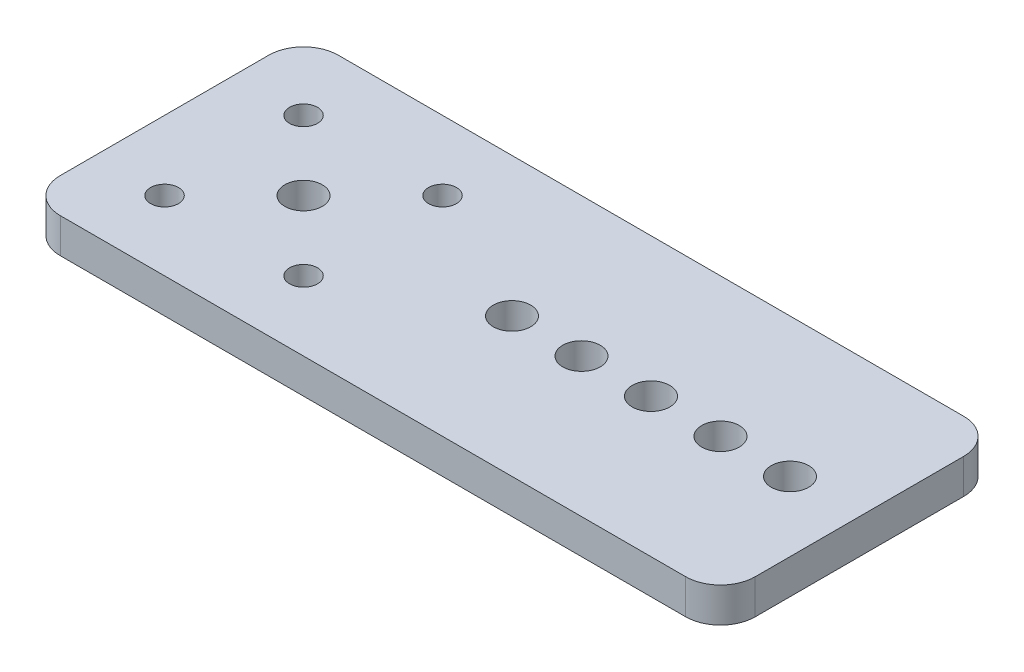
ISO-10303-21;
HEADER;
FILE_DESCRIPTION(('STEP AP214'),'2;1');
FILE_NAME('part.step','',(''),(''),'','','');
FILE_SCHEMA(('AUTOMOTIVE_DESIGN { 1 0 10303 214 1 1 1 1 }'));
ENDSEC;
DATA;
#1=APPLICATION_CONTEXT('core data for automotive mechanical design processes');
#2=APPLICATION_PROTOCOL_DEFINITION('international standard','automotive_design',2000,#1);
#3=PRODUCT_CONTEXT('',#1,'mechanical');
#4=PRODUCT('Part','Part','',(#3));
#5=PRODUCT_RELATED_PRODUCT_CATEGORY('part','',(#4));
#6=PRODUCT_DEFINITION_FORMATION('','',#4);
#7=PRODUCT_DEFINITION_CONTEXT('part definition',#1,'design');
#8=PRODUCT_DEFINITION('design','',#6,#7);
#9=PRODUCT_DEFINITION_SHAPE('','',#8);
#10=(LENGTH_UNIT() NAMED_UNIT(*) SI_UNIT(.MILLI.,.METRE.));
#11=(NAMED_UNIT(*) PLANE_ANGLE_UNIT() SI_UNIT($,.RADIAN.));
#12=(NAMED_UNIT(*) SI_UNIT($,.STERADIAN.) SOLID_ANGLE_UNIT());
#13=UNCERTAINTY_MEASURE_WITH_UNIT(LENGTH_MEASURE(1.E-05),#10,'distance_accuracy_value','');
#14=(GEOMETRIC_REPRESENTATION_CONTEXT(3) GLOBAL_UNCERTAINTY_ASSIGNED_CONTEXT((#13)) GLOBAL_UNIT_ASSIGNED_CONTEXT((#10,
#11,#12)) REPRESENTATION_CONTEXT('',''));
#15=CARTESIAN_POINT('',(0.,0.,0.));
#16=DIRECTION('',(0.,0.,1.));
#17=DIRECTION('',(1.,0.,0.));
#18=AXIS2_PLACEMENT_3D('',#15,#16,#17);
#19=CARTESIAN_POINT('',(0.,6.35,0.));
#20=DIRECTION('',(0.,1.,0.));
#21=DIRECTION('',(0.,0.,1.));
#22=AXIS2_PLACEMENT_3D('',#19,#20,#21);
#23=PLANE('',#22);
#24=CARTESIAN_POINT('',(88.9,6.35,25.4));
#25=DIRECTION('',(0.,1.,0.));
#26=DIRECTION('',(0.,0.,1.));
#27=AXIS2_PLACEMENT_3D('',#24,#25,#26);
#28=CIRCLE('',#27,3.429);
#29=CARTESIAN_POINT('',(88.9,6.35,28.829));
#30=VERTEX_POINT('',#29);
#31=EDGE_CURVE('E241',#30,#30,#28,.T.);
#32=ORIENTED_EDGE('',*,*,#31,.F.);
#33=EDGE_LOOP('',(#32));
#34=FACE_BOUND('',#33,.T.);
#35=CARTESIAN_POINT('',(63.5,6.35,25.4));
#36=DIRECTION('',(0.,1.,0.));
#37=DIRECTION('',(0.,0.,1.));
#38=AXIS2_PLACEMENT_3D('',#35,#36,#37);
#39=CIRCLE('',#38,3.429);
#40=CARTESIAN_POINT('',(63.5,6.35,28.829));
#41=VERTEX_POINT('',#40);
#42=EDGE_CURVE('E256',#41,#41,#39,.T.);
#43=ORIENTED_EDGE('',*,*,#42,.F.);
#44=EDGE_LOOP('',(#43));
#45=FACE_BOUND('',#44,.T.);
#46=CARTESIAN_POINT('',(38.1000000000003,6.35,38.1));
#47=DIRECTION('',(0.,1.,0.));
#48=DIRECTION('',(0.,0.,1.));
#49=AXIS2_PLACEMENT_3D('',#46,#47,#48);
#50=CIRCLE('',#49,2.5527);
#51=CARTESIAN_POINT('',(38.1000000000003,6.35,40.6527));
#52=VERTEX_POINT('',#51);
#53=EDGE_CURVE('E273',#52,#52,#50,.T.);
#54=ORIENTED_EDGE('',*,*,#53,.F.);
#55=EDGE_LOOP('',(#54));
#56=FACE_BOUND('',#55,.T.);
#57=CARTESIAN_POINT('',(101.6,6.35,25.4));
#58=DIRECTION('',(0.,1.,0.));
#59=DIRECTION('',(0.,0.,1.));
#60=AXIS2_PLACEMENT_3D('',#57,#58,#59);
#61=CIRCLE('',#60,3.429);
#62=CARTESIAN_POINT('',(101.6,6.35,28.829));
#63=VERTEX_POINT('',#62);
#64=EDGE_CURVE('E274',#63,#63,#61,.T.);
#65=ORIENTED_EDGE('',*,*,#64,.F.);
#66=EDGE_LOOP('',(#65));
#67=FACE_BOUND('',#66,.T.);
#68=CARTESIAN_POINT('',(12.7,6.35,12.7));
#69=DIRECTION('',(0.,1.,0.));
#70=DIRECTION('',(0.,0.,1.));
#71=AXIS2_PLACEMENT_3D('',#68,#69,#70);
#72=CIRCLE('',#71,2.5527);
#73=CARTESIAN_POINT('',(12.7,6.35,15.2527));
#74=VERTEX_POINT('',#73);
#75=EDGE_CURVE('E131',#74,#74,#72,.T.);
#76=ORIENTED_EDGE('',*,*,#75,.F.);
#77=EDGE_LOOP('',(#76));
#78=FACE_BOUND('',#77,.T.);
#79=DIRECTION('',(-1.,0.,0.));
#80=VECTOR('',#79,1.);
#81=CARTESIAN_POINT('',(0.,6.35,0.));
#82=LINE('',#81,#80);
#83=CARTESIAN_POINT('',(120.65,6.35,0.));
#84=VERTEX_POINT('',#83);
#85=CARTESIAN_POINT('',(6.35,6.35,0.));
#86=VERTEX_POINT('',#85);
#87=EDGE_CURVE('E141',#84,#86,#82,.T.);
#88=ORIENTED_EDGE('',*,*,#87,.T.);
#89=CARTESIAN_POINT('',(6.35,6.35,6.35));
#90=DIRECTION('',(0.,1.,0.));
#91=DIRECTION('',(0.,0.,1.));
#92=AXIS2_PLACEMENT_3D('',#89,#90,#91);
#93=CIRCLE('',#92,6.35);
#94=CARTESIAN_POINT('',(0.,6.35,6.35));
#95=VERTEX_POINT('',#94);
#96=EDGE_CURVE('E186',#86,#95,#93,.T.);
#97=ORIENTED_EDGE('',*,*,#96,.T.);
#98=DIRECTION('',(0.,0.,1.));
#99=VECTOR('',#98,1.);
#100=CARTESIAN_POINT('',(0.,6.35,0.));
#101=LINE('',#100,#99);
#102=CARTESIAN_POINT('',(0.,6.35,44.45));
#103=VERTEX_POINT('',#102);
#104=EDGE_CURVE('E123',#95,#103,#101,.T.);
#105=ORIENTED_EDGE('',*,*,#104,.T.);
#106=CARTESIAN_POINT('',(6.35,6.35,44.45));
#107=DIRECTION('',(0.,1.,0.));
#108=DIRECTION('',(0.,0.,1.));
#109=AXIS2_PLACEMENT_3D('',#106,#107,#108);
#110=CIRCLE('',#109,6.35);
#111=CARTESIAN_POINT('',(6.35,6.35,50.8));
#112=VERTEX_POINT('',#111);
#113=EDGE_CURVE('E183',#103,#112,#110,.T.);
#114=ORIENTED_EDGE('',*,*,#113,.T.);
#115=DIRECTION('',(1.,0.,0.));
#116=VECTOR('',#115,1.);
#117=CARTESIAN_POINT('',(0.,6.35,50.8));
#118=LINE('',#117,#116);
#119=CARTESIAN_POINT('',(120.65,6.35,50.8));
#120=VERTEX_POINT('',#119);
#121=EDGE_CURVE('E172',#112,#120,#118,.T.);
#122=ORIENTED_EDGE('',*,*,#121,.T.);
#123=CARTESIAN_POINT('',(120.65,6.35,44.45));
#124=DIRECTION('',(0.,1.,0.));
#125=DIRECTION('',(0.,0.,1.));
#126=AXIS2_PLACEMENT_3D('',#123,#124,#125);
#127=CIRCLE('',#126,6.35);
#128=CARTESIAN_POINT('',(127.,6.35,44.45));
#129=VERTEX_POINT('',#128);
#130=EDGE_CURVE('E58',#120,#129,#127,.T.);
#131=ORIENTED_EDGE('',*,*,#130,.T.);
#132=DIRECTION('',(0.,0.,-1.));
#133=VECTOR('',#132,1.);
#134=CARTESIAN_POINT('',(127.,6.35,0.));
#135=LINE('',#134,#133);
#136=CARTESIAN_POINT('',(127.,6.35,6.35));
#137=VERTEX_POINT('',#136);
#138=EDGE_CURVE('E169',#129,#137,#135,.T.);
#139=ORIENTED_EDGE('',*,*,#138,.T.);
#140=CARTESIAN_POINT('',(120.65,6.35,6.35));
#141=DIRECTION('',(0.,1.,0.));
#142=DIRECTION('',(0.,0.,1.));
#143=AXIS2_PLACEMENT_3D('',#140,#141,#142);
#144=CIRCLE('',#143,6.35);
#145=EDGE_CURVE('E159',#137,#84,#144,.T.);
#146=ORIENTED_EDGE('',*,*,#145,.T.);
#147=EDGE_LOOP('',(#88,#97,#105,#114,#122,#131,#139,#146));
#148=FACE_BOUND('',#147,.T.);
#149=CARTESIAN_POINT('',(25.4,6.35,25.4));
#150=DIRECTION('',(0.,1.,0.));
#151=DIRECTION('',(0.,0.,1.));
#152=AXIS2_PLACEMENT_3D('',#149,#150,#151);
#153=CIRCLE('',#152,3.429);
#154=CARTESIAN_POINT('',(25.4,6.35,28.829));
#155=VERTEX_POINT('',#154);
#156=EDGE_CURVE('E211',#155,#155,#153,.T.);
#157=ORIENTED_EDGE('',*,*,#156,.F.);
#158=EDGE_LOOP('',(#157));
#159=FACE_BOUND('',#158,.T.);
#160=CARTESIAN_POINT('',(38.1,6.35,12.7));
#161=DIRECTION('',(0.,1.,0.));
#162=DIRECTION('',(0.,0.,1.));
#163=AXIS2_PLACEMENT_3D('',#160,#161,#162);
#164=CIRCLE('',#163,2.5527);
#165=CARTESIAN_POINT('',(38.1,6.35,15.2527));
#166=VERTEX_POINT('',#165);
#167=EDGE_CURVE('E216',#166,#166,#164,.T.);
#168=ORIENTED_EDGE('',*,*,#167,.F.);
#169=EDGE_LOOP('',(#168));
#170=FACE_BOUND('',#169,.T.);
#171=CARTESIAN_POINT('',(12.7000000000003,6.35,38.1));
#172=DIRECTION('',(0.,1.,0.));
#173=DIRECTION('',(0.,0.,1.));
#174=AXIS2_PLACEMENT_3D('',#171,#172,#173);
#175=CIRCLE('',#174,2.5527);
#176=CARTESIAN_POINT('',(12.7000000000003,6.35,40.6527));
#177=VERTEX_POINT('',#176);
#178=EDGE_CURVE('E222',#177,#177,#175,.T.);
#179=ORIENTED_EDGE('',*,*,#178,.F.);
#180=EDGE_LOOP('',(#179));
#181=FACE_BOUND('',#180,.T.);
#182=CARTESIAN_POINT('',(76.2,6.35,25.4));
#183=DIRECTION('',(0.,1.,0.));
#184=DIRECTION('',(0.,0.,1.));
#185=AXIS2_PLACEMENT_3D('',#182,#183,#184);
#186=CIRCLE('',#185,3.429);
#187=CARTESIAN_POINT('',(76.2,6.35,28.829));
#188=VERTEX_POINT('',#187);
#189=EDGE_CURVE('E228',#188,#188,#186,.T.);
#190=ORIENTED_EDGE('',*,*,#189,.F.);
#191=EDGE_LOOP('',(#190));
#192=FACE_BOUND('',#191,.T.);
#193=CARTESIAN_POINT('',(114.3,6.35,25.4));
#194=DIRECTION('',(0.,1.,0.));
#195=DIRECTION('',(0.,0.,1.));
#196=AXIS2_PLACEMENT_3D('',#193,#194,#195);
#197=CIRCLE('',#196,3.429);
#198=CARTESIAN_POINT('',(114.3,6.35,28.829));
#199=VERTEX_POINT('',#198);
#200=EDGE_CURVE('E234',#199,#199,#197,.T.);
#201=ORIENTED_EDGE('',*,*,#200,.F.);
#202=EDGE_LOOP('',(#201));
#203=FACE_BOUND('',#202,.T.);
#204=ADVANCED_FACE('F38',(#34,#45,#56,#67,#78,#148,#159,#170,#181,#192,#203),#23,.T.);
#205=CARTESIAN_POINT('',(0.,0.,0.));
#206=DIRECTION('',(0.,1.,0.));
#207=DIRECTION('',(0.,0.,1.));
#208=AXIS2_PLACEMENT_3D('',#205,#206,#207);
#209=PLANE('',#208);
#210=DIRECTION('',(0.,0.,1.));
#211=VECTOR('',#210,1.);
#212=CARTESIAN_POINT('',(0.,0.,0.));
#213=LINE('',#212,#211);
#214=CARTESIAN_POINT('',(0.,0.,6.35));
#215=VERTEX_POINT('',#214);
#216=CARTESIAN_POINT('',(0.,0.,44.45));
#217=VERTEX_POINT('',#216);
#218=EDGE_CURVE('E120',#215,#217,#213,.T.);
#219=ORIENTED_EDGE('',*,*,#218,.F.);
#220=CARTESIAN_POINT('',(6.35,0.,6.35));
#221=DIRECTION('',(0.,1.,0.));
#222=DIRECTION('',(0.,0.,1.));
#223=AXIS2_PLACEMENT_3D('',#220,#221,#222);
#224=CIRCLE('',#223,6.35);
#225=CARTESIAN_POINT('',(6.35,0.,0.));
#226=VERTEX_POINT('',#225);
#227=EDGE_CURVE('E103',#215,#226,#224,.F.);
#228=ORIENTED_EDGE('',*,*,#227,.T.);
#229=DIRECTION('',(-1.,0.,0.));
#230=VECTOR('',#229,1.);
#231=CARTESIAN_POINT('',(0.,0.,0.));
#232=LINE('',#231,#230);
#233=CARTESIAN_POINT('',(120.65,0.,0.));
#234=VERTEX_POINT('',#233);
#235=EDGE_CURVE('E146',#234,#226,#232,.T.);
#236=ORIENTED_EDGE('',*,*,#235,.F.);
#237=CARTESIAN_POINT('',(120.65,0.,6.35));
#238=DIRECTION('',(0.,1.,0.));
#239=DIRECTION('',(0.,0.,1.));
#240=AXIS2_PLACEMENT_3D('',#237,#238,#239);
#241=CIRCLE('',#240,6.35);
#242=CARTESIAN_POINT('',(127.,0.,6.35));
#243=VERTEX_POINT('',#242);
#244=EDGE_CURVE('E150',#234,#243,#241,.F.);
#245=ORIENTED_EDGE('',*,*,#244,.T.);
#246=DIRECTION('',(0.,0.,-1.));
#247=VECTOR('',#246,1.);
#248=CARTESIAN_POINT('',(127.,0.,0.));
#249=LINE('',#248,#247);
#250=CARTESIAN_POINT('',(127.,0.,44.45));
#251=VERTEX_POINT('',#250);
#252=EDGE_CURVE('E134',#251,#243,#249,.T.);
#253=ORIENTED_EDGE('',*,*,#252,.F.);
#254=CARTESIAN_POINT('',(120.65,0.,44.45));
#255=DIRECTION('',(0.,1.,0.));
#256=DIRECTION('',(0.,0.,1.));
#257=AXIS2_PLACEMENT_3D('',#254,#255,#256);
#258=CIRCLE('',#257,6.35);
#259=CARTESIAN_POINT('',(120.65,0.,50.8));
#260=VERTEX_POINT('',#259);
#261=EDGE_CURVE('E124',#251,#260,#258,.F.);
#262=ORIENTED_EDGE('',*,*,#261,.T.);
#263=DIRECTION('',(1.,0.,0.));
#264=VECTOR('',#263,1.);
#265=CARTESIAN_POINT('',(0.,0.,50.8));
#266=LINE('',#265,#264);
#267=CARTESIAN_POINT('',(6.35,0.,50.8));
#268=VERTEX_POINT('',#267);
#269=EDGE_CURVE('E130',#268,#260,#266,.T.);
#270=ORIENTED_EDGE('',*,*,#269,.F.);
#271=CARTESIAN_POINT('',(6.35,0.,44.45));
#272=DIRECTION('',(0.,1.,0.));
#273=DIRECTION('',(0.,0.,1.));
#274=AXIS2_PLACEMENT_3D('',#271,#272,#273);
#275=CIRCLE('',#274,6.35);
#276=EDGE_CURVE('E114',#268,#217,#275,.F.);
#277=ORIENTED_EDGE('',*,*,#276,.T.);
#278=EDGE_LOOP('',(#219,#228,#236,#245,#253,#262,#270,#277));
#279=FACE_BOUND('',#278,.T.);
#280=CARTESIAN_POINT('',(12.7,0.,12.7));
#281=DIRECTION('',(0.,1.,0.));
#282=DIRECTION('',(0.,0.,1.));
#283=AXIS2_PLACEMENT_3D('',#280,#281,#282);
#284=CIRCLE('',#283,2.5527);
#285=CARTESIAN_POINT('',(12.7,0.,15.2527));
#286=VERTEX_POINT('',#285);
#287=EDGE_CURVE('E138',#286,#286,#284,.T.);
#288=ORIENTED_EDGE('',*,*,#287,.T.);
#289=EDGE_LOOP('',(#288));
#290=FACE_BOUND('',#289,.T.);
#291=CARTESIAN_POINT('',(25.4,0.,25.4));
#292=DIRECTION('',(0.,1.,0.));
#293=DIRECTION('',(0.,0.,1.));
#294=AXIS2_PLACEMENT_3D('',#291,#292,#293);
#295=CIRCLE('',#294,3.429);
#296=CARTESIAN_POINT('',(25.4,0.,28.829));
#297=VERTEX_POINT('',#296);
#298=EDGE_CURVE('E214',#297,#297,#295,.T.);
#299=ORIENTED_EDGE('',*,*,#298,.T.);
#300=EDGE_LOOP('',(#299));
#301=FACE_BOUND('',#300,.T.);
#302=CARTESIAN_POINT('',(101.6,0.,25.4));
#303=DIRECTION('',(0.,1.,0.));
#304=DIRECTION('',(0.,0.,1.));
#305=AXIS2_PLACEMENT_3D('',#302,#303,#304);
#306=CIRCLE('',#305,3.429);
#307=CARTESIAN_POINT('',(101.6,0.,28.829));
#308=VERTEX_POINT('',#307);
#309=EDGE_CURVE('E219',#308,#308,#306,.T.);
#310=ORIENTED_EDGE('',*,*,#309,.T.);
#311=EDGE_LOOP('',(#310));
#312=FACE_BOUND('',#311,.T.);
#313=CARTESIAN_POINT('',(38.1,0.,12.7));
#314=DIRECTION('',(0.,1.,0.));
#315=DIRECTION('',(0.,0.,1.));
#316=AXIS2_PLACEMENT_3D('',#313,#314,#315);
#317=CIRCLE('',#316,2.5527);
#318=CARTESIAN_POINT('',(38.1,0.,15.2527));
#319=VERTEX_POINT('',#318);
#320=EDGE_CURVE('E220',#319,#319,#317,.T.);
#321=ORIENTED_EDGE('',*,*,#320,.T.);
#322=EDGE_LOOP('',(#321));
#323=FACE_BOUND('',#322,.T.);
#324=CARTESIAN_POINT('',(38.1000000000003,0.,38.1));
#325=DIRECTION('',(0.,1.,0.));
#326=DIRECTION('',(0.,0.,1.));
#327=AXIS2_PLACEMENT_3D('',#324,#325,#326);
#328=CIRCLE('',#327,2.5527);
#329=CARTESIAN_POINT('',(38.1000000000003,0.,40.6527));
#330=VERTEX_POINT('',#329);
#331=EDGE_CURVE('E225',#330,#330,#328,.T.);
#332=ORIENTED_EDGE('',*,*,#331,.T.);
#333=EDGE_LOOP('',(#332));
#334=FACE_BOUND('',#333,.T.);
#335=CARTESIAN_POINT('',(12.7000000000003,0.,38.1));
#336=DIRECTION('',(0.,1.,0.));
#337=DIRECTION('',(0.,0.,1.));
#338=AXIS2_PLACEMENT_3D('',#335,#336,#337);
#339=CIRCLE('',#338,2.5527);
#340=CARTESIAN_POINT('',(12.7000000000003,0.,40.6527));
#341=VERTEX_POINT('',#340);
#342=EDGE_CURVE('E226',#341,#341,#339,.T.);
#343=ORIENTED_EDGE('',*,*,#342,.T.);
#344=EDGE_LOOP('',(#343));
#345=FACE_BOUND('',#344,.T.);
#346=CARTESIAN_POINT('',(63.5,0.,25.4));
#347=DIRECTION('',(0.,1.,0.));
#348=DIRECTION('',(0.,0.,1.));
#349=AXIS2_PLACEMENT_3D('',#346,#347,#348);
#350=CIRCLE('',#349,3.429);
#351=CARTESIAN_POINT('',(63.5,0.,28.829));
#352=VERTEX_POINT('',#351);
#353=EDGE_CURVE('E231',#352,#352,#350,.T.);
#354=ORIENTED_EDGE('',*,*,#353,.T.);
#355=EDGE_LOOP('',(#354));
#356=FACE_BOUND('',#355,.T.);
#357=CARTESIAN_POINT('',(76.2,0.,25.4));
#358=DIRECTION('',(0.,1.,0.));
#359=DIRECTION('',(0.,0.,1.));
#360=AXIS2_PLACEMENT_3D('',#357,#358,#359);
#361=CIRCLE('',#360,3.429);
#362=CARTESIAN_POINT('',(76.2,0.,28.829));
#363=VERTEX_POINT('',#362);
#364=EDGE_CURVE('E232',#363,#363,#361,.T.);
#365=ORIENTED_EDGE('',*,*,#364,.T.);
#366=EDGE_LOOP('',(#365));
#367=FACE_BOUND('',#366,.T.);
#368=CARTESIAN_POINT('',(88.9,0.,25.4));
#369=DIRECTION('',(0.,1.,0.));
#370=DIRECTION('',(0.,0.,1.));
#371=AXIS2_PLACEMENT_3D('',#368,#369,#370);
#372=CIRCLE('',#371,3.429);
#373=CARTESIAN_POINT('',(88.9,0.,28.829));
#374=VERTEX_POINT('',#373);
#375=EDGE_CURVE('E236',#374,#374,#372,.T.);
#376=ORIENTED_EDGE('',*,*,#375,.T.);
#377=EDGE_LOOP('',(#376));
#378=FACE_BOUND('',#377,.T.);
#379=CARTESIAN_POINT('',(114.3,0.,25.4));
#380=DIRECTION('',(0.,1.,0.));
#381=DIRECTION('',(0.,0.,1.));
#382=AXIS2_PLACEMENT_3D('',#379,#380,#381);
#383=CIRCLE('',#382,3.429);
#384=CARTESIAN_POINT('',(114.3,0.,28.829));
#385=VERTEX_POINT('',#384);
#386=EDGE_CURVE('E237',#385,#385,#383,.T.);
#387=ORIENTED_EDGE('',*,*,#386,.T.);
#388=EDGE_LOOP('',(#387));
#389=FACE_BOUND('',#388,.T.);
#390=ADVANCED_FACE('F127',(#279,#290,#301,#312,#323,#334,#345,#356,#367,#378,#389),#209,.F.);
#391=CARTESIAN_POINT('',(0.,6.35,0.));
#392=DIRECTION('',(1.,0.,0.));
#393=DIRECTION('',(0.,0.,-1.));
#394=AXIS2_PLACEMENT_3D('',#391,#392,#393);
#395=PLANE('',#394);
#396=ORIENTED_EDGE('',*,*,#104,.F.);
#397=DIRECTION('',(0.,-1.,0.));
#398=VECTOR('',#397,1.);
#399=CARTESIAN_POINT('',(0.,6.35,6.35));
#400=LINE('',#399,#398);
#401=EDGE_CURVE('E107',#95,#215,#400,.T.);
#402=ORIENTED_EDGE('',*,*,#401,.T.);
#403=ORIENTED_EDGE('',*,*,#218,.T.);
#404=DIRECTION('',(0.,-1.,0.));
#405=VECTOR('',#404,1.);
#406=CARTESIAN_POINT('',(0.,6.35,44.45));
#407=LINE('',#406,#405);
#408=EDGE_CURVE('E125',#217,#103,#407,.F.);
#409=ORIENTED_EDGE('',*,*,#408,.T.);
#410=EDGE_LOOP('',(#396,#402,#403,#409));
#411=FACE_BOUND('',#410,.T.);
#412=ADVANCED_FACE('F119',(#411),#395,.F.);
#413=CARTESIAN_POINT('',(0.,6.35,50.8));
#414=DIRECTION('',(0.,0.,-1.));
#415=DIRECTION('',(-1.,0.,0.));
#416=AXIS2_PLACEMENT_3D('',#413,#414,#415);
#417=PLANE('',#416);
#418=ORIENTED_EDGE('',*,*,#121,.F.);
#419=DIRECTION('',(0.,-1.,0.));
#420=VECTOR('',#419,1.);
#421=CARTESIAN_POINT('',(6.35,6.35,50.8));
#422=LINE('',#421,#420);
#423=EDGE_CURVE('E192',#112,#268,#422,.T.);
#424=ORIENTED_EDGE('',*,*,#423,.T.);
#425=ORIENTED_EDGE('',*,*,#269,.T.);
#426=DIRECTION('',(0.,-1.,0.));
#427=VECTOR('',#426,1.);
#428=CARTESIAN_POINT('',(120.65,6.35,50.8));
#429=LINE('',#428,#427);
#430=EDGE_CURVE('E190',#260,#120,#429,.F.);
#431=ORIENTED_EDGE('',*,*,#430,.T.);
#432=EDGE_LOOP('',(#418,#424,#425,#431));
#433=FACE_BOUND('',#432,.T.);
#434=ADVANCED_FACE('F316',(#433),#417,.F.);
#435=CARTESIAN_POINT('',(127.,6.35,0.));
#436=DIRECTION('',(-1.,0.,0.));
#437=DIRECTION('',(0.,0.,1.));
#438=AXIS2_PLACEMENT_3D('',#435,#436,#437);
#439=PLANE('',#438);
#440=ORIENTED_EDGE('',*,*,#252,.T.);
#441=DIRECTION('',(0.,-1.,0.));
#442=VECTOR('',#441,1.);
#443=CARTESIAN_POINT('',(127.,6.35,6.35));
#444=LINE('',#443,#442);
#445=EDGE_CURVE('E12',#243,#137,#444,.F.);
#446=ORIENTED_EDGE('',*,*,#445,.T.);
#447=ORIENTED_EDGE('',*,*,#138,.F.);
#448=DIRECTION('',(0.,-1.,0.));
#449=VECTOR('',#448,1.);
#450=CARTESIAN_POINT('',(127.,6.35,44.45));
#451=LINE('',#450,#449);
#452=EDGE_CURVE('E46',#129,#251,#451,.T.);
#453=ORIENTED_EDGE('',*,*,#452,.T.);
#454=EDGE_LOOP('',(#440,#446,#447,#453));
#455=FACE_BOUND('',#454,.T.);
#456=ADVANCED_FACE('F197',(#455),#439,.F.);
#457=CARTESIAN_POINT('',(0.,6.35,0.));
#458=DIRECTION('',(0.,0.,1.));
#459=DIRECTION('',(1.,0.,0.));
#460=AXIS2_PLACEMENT_3D('',#457,#458,#459);
#461=PLANE('',#460);
#462=ORIENTED_EDGE('',*,*,#235,.T.);
#463=DIRECTION('',(0.,-1.,0.));
#464=VECTOR('',#463,1.);
#465=CARTESIAN_POINT('',(6.35,6.35,0.));
#466=LINE('',#465,#464);
#467=EDGE_CURVE('E108',#226,#86,#466,.F.);
#468=ORIENTED_EDGE('',*,*,#467,.T.);
#469=ORIENTED_EDGE('',*,*,#87,.F.);
#470=DIRECTION('',(0.,-1.,0.));
#471=VECTOR('',#470,1.);
#472=CARTESIAN_POINT('',(120.65,6.35,0.));
#473=LINE('',#472,#471);
#474=EDGE_CURVE('E113',#84,#234,#473,.T.);
#475=ORIENTED_EDGE('',*,*,#474,.T.);
#476=EDGE_LOOP('',(#462,#468,#469,#475));
#477=FACE_BOUND('',#476,.T.);
#478=ADVANCED_FACE('F205',(#477),#461,.F.);
#479=CARTESIAN_POINT('',(12.7,6.35,12.7));
#480=DIRECTION('',(0.,-1.,0.));
#481=DIRECTION('',(0.,0.,-1.));
#482=AXIS2_PLACEMENT_3D('',#479,#480,#481);
#483=CYLINDRICAL_SURFACE('',#482,2.5527);
#484=ORIENTED_EDGE('',*,*,#75,.T.);
#485=EDGE_LOOP('',(#484));
#486=FACE_BOUND('',#485,.T.);
#487=ORIENTED_EDGE('',*,*,#287,.F.);
#488=EDGE_LOOP('',(#487));
#489=FACE_BOUND('',#488,.T.);
#490=ADVANCED_FACE('F290',(#486,#489),#483,.F.);
#491=CARTESIAN_POINT('',(25.4,6.35,25.4));
#492=DIRECTION('',(0.,-1.,0.));
#493=DIRECTION('',(0.,0.,-1.));
#494=AXIS2_PLACEMENT_3D('',#491,#492,#493);
#495=CYLINDRICAL_SURFACE('',#494,3.429);
#496=ORIENTED_EDGE('',*,*,#156,.T.);
#497=EDGE_LOOP('',(#496));
#498=FACE_BOUND('',#497,.T.);
#499=ORIENTED_EDGE('',*,*,#298,.F.);
#500=EDGE_LOOP('',(#499));
#501=FACE_BOUND('',#500,.T.);
#502=ADVANCED_FACE('F287',(#498,#501),#495,.F.);
#503=CARTESIAN_POINT('',(101.6,6.35,25.4));
#504=DIRECTION('',(0.,-1.,0.));
#505=DIRECTION('',(0.,0.,-1.));
#506=AXIS2_PLACEMENT_3D('',#503,#504,#505);
#507=CYLINDRICAL_SURFACE('',#506,3.429);
#508=ORIENTED_EDGE('',*,*,#64,.T.);
#509=EDGE_LOOP('',(#508));
#510=FACE_BOUND('',#509,.T.);
#511=ORIENTED_EDGE('',*,*,#309,.F.);
#512=EDGE_LOOP('',(#511));
#513=FACE_BOUND('',#512,.T.);
#514=ADVANCED_FACE('F289',(#510,#513),#507,.F.);
#515=CARTESIAN_POINT('',(38.1,6.35,12.7));
#516=DIRECTION('',(0.,-1.,0.));
#517=DIRECTION('',(0.,0.,-1.));
#518=AXIS2_PLACEMENT_3D('',#515,#516,#517);
#519=CYLINDRICAL_SURFACE('',#518,2.5527);
#520=ORIENTED_EDGE('',*,*,#167,.T.);
#521=EDGE_LOOP('',(#520));
#522=FACE_BOUND('',#521,.T.);
#523=ORIENTED_EDGE('',*,*,#320,.F.);
#524=EDGE_LOOP('',(#523));
#525=FACE_BOUND('',#524,.T.);
#526=ADVANCED_FACE('F297',(#522,#525),#519,.F.);
#527=CARTESIAN_POINT('',(38.1000000000003,6.35,38.1));
#528=DIRECTION('',(0.,-1.,0.));
#529=DIRECTION('',(0.,0.,-1.));
#530=AXIS2_PLACEMENT_3D('',#527,#528,#529);
#531=CYLINDRICAL_SURFACE('',#530,2.5527);
#532=ORIENTED_EDGE('',*,*,#53,.T.);
#533=EDGE_LOOP('',(#532));
#534=FACE_BOUND('',#533,.T.);
#535=ORIENTED_EDGE('',*,*,#331,.F.);
#536=EDGE_LOOP('',(#535));
#537=FACE_BOUND('',#536,.T.);
#538=ADVANCED_FACE('F376',(#534,#537),#531,.F.);
#539=CARTESIAN_POINT('',(12.7000000000003,6.35,38.1));
#540=DIRECTION('',(0.,-1.,0.));
#541=DIRECTION('',(0.,0.,-1.));
#542=AXIS2_PLACEMENT_3D('',#539,#540,#541);
#543=CYLINDRICAL_SURFACE('',#542,2.5527);
#544=ORIENTED_EDGE('',*,*,#178,.T.);
#545=EDGE_LOOP('',(#544));
#546=FACE_BOUND('',#545,.T.);
#547=ORIENTED_EDGE('',*,*,#342,.F.);
#548=EDGE_LOOP('',(#547));
#549=FACE_BOUND('',#548,.T.);
#550=ADVANCED_FACE('F372',(#546,#549),#543,.F.);
#551=CARTESIAN_POINT('',(63.5,6.35,25.4));
#552=DIRECTION('',(0.,-1.,0.));
#553=DIRECTION('',(0.,0.,-1.));
#554=AXIS2_PLACEMENT_3D('',#551,#552,#553);
#555=CYLINDRICAL_SURFACE('',#554,3.429);
#556=ORIENTED_EDGE('',*,*,#42,.T.);
#557=EDGE_LOOP('',(#556));
#558=FACE_BOUND('',#557,.T.);
#559=ORIENTED_EDGE('',*,*,#353,.F.);
#560=EDGE_LOOP('',(#559));
#561=FACE_BOUND('',#560,.T.);
#562=ADVANCED_FACE('F352',(#558,#561),#555,.F.);
#563=CARTESIAN_POINT('',(76.2,6.35,25.4));
#564=DIRECTION('',(0.,-1.,0.));
#565=DIRECTION('',(0.,0.,-1.));
#566=AXIS2_PLACEMENT_3D('',#563,#564,#565);
#567=CYLINDRICAL_SURFACE('',#566,3.429);
#568=ORIENTED_EDGE('',*,*,#189,.T.);
#569=EDGE_LOOP('',(#568));
#570=FACE_BOUND('',#569,.T.);
#571=ORIENTED_EDGE('',*,*,#364,.F.);
#572=EDGE_LOOP('',(#571));
#573=FACE_BOUND('',#572,.T.);
#574=ADVANCED_FACE('F348',(#570,#573),#567,.F.);
#575=CARTESIAN_POINT('',(88.9,6.35,25.4));
#576=DIRECTION('',(0.,-1.,0.));
#577=DIRECTION('',(0.,0.,-1.));
#578=AXIS2_PLACEMENT_3D('',#575,#576,#577);
#579=CYLINDRICAL_SURFACE('',#578,3.429);
#580=ORIENTED_EDGE('',*,*,#31,.T.);
#581=EDGE_LOOP('',(#580));
#582=FACE_BOUND('',#581,.T.);
#583=ORIENTED_EDGE('',*,*,#375,.F.);
#584=EDGE_LOOP('',(#583));
#585=FACE_BOUND('',#584,.T.);
#586=ADVANCED_FACE('F351',(#582,#585),#579,.F.);
#587=CARTESIAN_POINT('',(114.3,6.35,25.4));
#588=DIRECTION('',(0.,-1.,0.));
#589=DIRECTION('',(0.,0.,-1.));
#590=AXIS2_PLACEMENT_3D('',#587,#588,#589);
#591=CYLINDRICAL_SURFACE('',#590,3.429);
#592=ORIENTED_EDGE('',*,*,#200,.T.);
#593=EDGE_LOOP('',(#592));
#594=FACE_BOUND('',#593,.T.);
#595=ORIENTED_EDGE('',*,*,#386,.F.);
#596=EDGE_LOOP('',(#595));
#597=FACE_BOUND('',#596,.T.);
#598=ADVANCED_FACE('F325',(#594,#597),#591,.F.);
#599=CARTESIAN_POINT('',(6.35,6.35,6.35));
#600=DIRECTION('',(0.,-1.,0.));
#601=DIRECTION('',(0.,0.,-1.));
#602=AXIS2_PLACEMENT_3D('',#599,#600,#601);
#603=CYLINDRICAL_SURFACE('',#602,6.35);
#604=ORIENTED_EDGE('',*,*,#96,.F.);
#605=ORIENTED_EDGE('',*,*,#467,.F.);
#606=ORIENTED_EDGE('',*,*,#227,.F.);
#607=ORIENTED_EDGE('',*,*,#401,.F.);
#608=EDGE_LOOP('',(#604,#605,#606,#607));
#609=FACE_BOUND('',#608,.T.);
#610=ADVANCED_FACE('F106',(#609),#603,.T.);
#611=CARTESIAN_POINT('',(6.35,6.35,44.45));
#612=DIRECTION('',(0.,-1.,0.));
#613=DIRECTION('',(0.,0.,-1.));
#614=AXIS2_PLACEMENT_3D('',#611,#612,#613);
#615=CYLINDRICAL_SURFACE('',#614,6.35);
#616=ORIENTED_EDGE('',*,*,#113,.F.);
#617=ORIENTED_EDGE('',*,*,#408,.F.);
#618=ORIENTED_EDGE('',*,*,#276,.F.);
#619=ORIENTED_EDGE('',*,*,#423,.F.);
#620=EDGE_LOOP('',(#616,#617,#618,#619));
#621=FACE_BOUND('',#620,.T.);
#622=ADVANCED_FACE('F324',(#621),#615,.T.);
#623=CARTESIAN_POINT('',(120.65,6.35,6.35));
#624=DIRECTION('',(0.,-1.,0.));
#625=DIRECTION('',(0.,0.,-1.));
#626=AXIS2_PLACEMENT_3D('',#623,#624,#625);
#627=CYLINDRICAL_SURFACE('',#626,6.35);
#628=ORIENTED_EDGE('',*,*,#145,.F.);
#629=ORIENTED_EDGE('',*,*,#445,.F.);
#630=ORIENTED_EDGE('',*,*,#244,.F.);
#631=ORIENTED_EDGE('',*,*,#474,.F.);
#632=EDGE_LOOP('',(#628,#629,#630,#631));
#633=FACE_BOUND('',#632,.T.);
#634=ADVANCED_FACE('F202',(#633),#627,.T.);
#635=CARTESIAN_POINT('',(120.65,6.35,44.45));
#636=DIRECTION('',(0.,-1.,0.));
#637=DIRECTION('',(0.,0.,-1.));
#638=AXIS2_PLACEMENT_3D('',#635,#636,#637);
#639=CYLINDRICAL_SURFACE('',#638,6.35);
#640=ORIENTED_EDGE('',*,*,#130,.F.);
#641=ORIENTED_EDGE('',*,*,#430,.F.);
#642=ORIENTED_EDGE('',*,*,#261,.F.);
#643=ORIENTED_EDGE('',*,*,#452,.F.);
#644=EDGE_LOOP('',(#640,#641,#642,#643));
#645=FACE_BOUND('',#644,.T.);
#646=ADVANCED_FACE('F40',(#645),#639,.T.);
#647=CLOSED_SHELL('',(#204,#390,#412,#434,#456,#478,#490,#502,#514,#526,#538,#550,#562,#574,
#586,#598,#610,#622,#634,#646));
#648=MANIFOLD_SOLID_BREP('B2',#647);
#649=ADVANCED_BREP_SHAPE_REPRESENTATION('',(#18,#648),#14);
#650=SHAPE_DEFINITION_REPRESENTATION(#9,#649);
ENDSEC;
END-ISO-10303-21;
